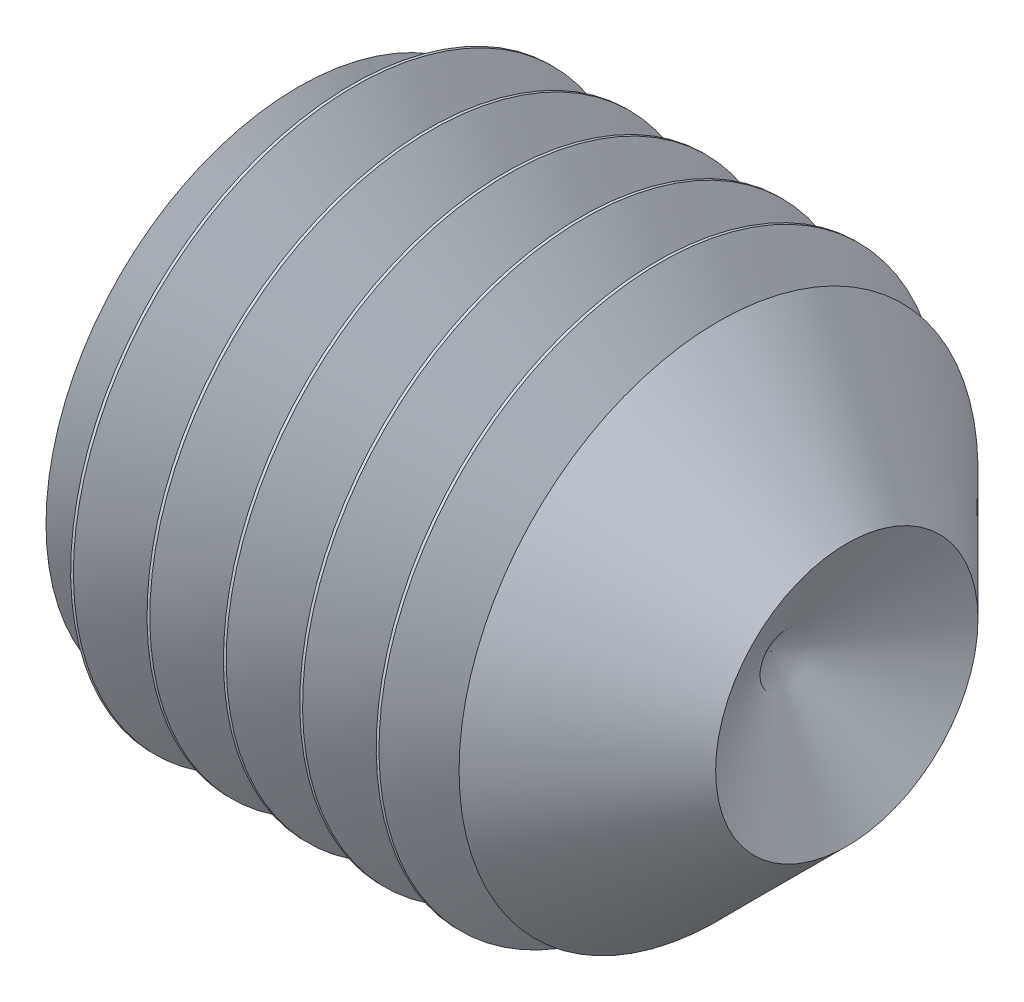
ISO-10303-21;
HEADER;
FILE_DESCRIPTION(('STEP AP214'),'2;1');
FILE_NAME('part.step','',(''),(''),'','','');
FILE_SCHEMA(('AUTOMOTIVE_DESIGN { 1 0 10303 214 1 1 1 1 }'));
ENDSEC;
DATA;
#1=APPLICATION_CONTEXT('core data for automotive mechanical design processes');
#2=APPLICATION_PROTOCOL_DEFINITION('international standard','automotive_design',2000,#1);
#3=PRODUCT_CONTEXT('',#1,'mechanical');
#4=PRODUCT('Part','Part','',(#3));
#5=PRODUCT_RELATED_PRODUCT_CATEGORY('part','',(#4));
#6=PRODUCT_DEFINITION_FORMATION('','',#4);
#7=PRODUCT_DEFINITION_CONTEXT('part definition',#1,'design');
#8=PRODUCT_DEFINITION('design','',#6,#7);
#9=PRODUCT_DEFINITION_SHAPE('','',#8);
#10=(LENGTH_UNIT() NAMED_UNIT(*) SI_UNIT(.MILLI.,.METRE.));
#11=(NAMED_UNIT(*) PLANE_ANGLE_UNIT() SI_UNIT($,.RADIAN.));
#12=(NAMED_UNIT(*) SI_UNIT($,.STERADIAN.) SOLID_ANGLE_UNIT());
#13=UNCERTAINTY_MEASURE_WITH_UNIT(LENGTH_MEASURE(1.E-05),#10,'distance_accuracy_value','');
#14=(GEOMETRIC_REPRESENTATION_CONTEXT(3) GLOBAL_UNCERTAINTY_ASSIGNED_CONTEXT((#13)) GLOBAL_UNIT_ASSIGNED_CONTEXT((#10,
#11,#12)) REPRESENTATION_CONTEXT('',''));
#15=CARTESIAN_POINT('',(0.,0.,0.));
#16=DIRECTION('',(0.,0.,1.));
#17=DIRECTION('',(1.,0.,0.));
#18=AXIS2_PLACEMENT_3D('',#15,#16,#17);
#19=CARTESIAN_POINT('',(0.,0.,0.));
#20=DIRECTION('',(-1.,0.,0.));
#21=DIRECTION('',(0.,0.,1.));
#22=AXIS2_PLACEMENT_3D('',#19,#20,#21);
#23=PLANE('',#22);
#24=CARTESIAN_POINT('',(0.,0.,0.));
#25=DIRECTION('',(-1.,0.,0.));
#26=DIRECTION('',(0.,0.,1.));
#27=AXIS2_PLACEMENT_3D('',#24,#25,#26);
#28=CIRCLE('',#27,1.2195);
#29=CARTESIAN_POINT('',(0.,0.,1.2195));
#30=VERTEX_POINT('',#29);
#31=EDGE_CURVE('E11',#30,#30,#28,.T.);
#32=ORIENTED_EDGE('',*,*,#31,.T.);
#33=EDGE_LOOP('',(#32));
#34=FACE_BOUND('',#33,.T.);
#35=DIRECTION('',(0.,0.,-1.));
#36=VECTOR('',#35,1.);
#37=CARTESIAN_POINT('',(0.,0.750000000000003,0.433012701892216));
#38=LINE('',#37,#36);
#39=CARTESIAN_POINT('',(0.,0.750000000000003,0.433012701892216));
#40=VERTEX_POINT('',#39);
#41=CARTESIAN_POINT('',(0.,0.750000000000003,-0.433012701892222));
#42=VERTEX_POINT('',#41);
#43=EDGE_CURVE('E97',#40,#42,#38,.T.);
#44=ORIENTED_EDGE('',*,*,#43,.F.);
#45=DIRECTION('',(0.,-0.866025403784439,0.5));
#46=VECTOR('',#45,1.);
#47=CARTESIAN_POINT('',(0.,0.750000000000003,0.433012701892216));
#48=LINE('',#47,#46);
#49=CARTESIAN_POINT('',(0.,0.,0.866025403784435));
#50=VERTEX_POINT('',#49);
#51=EDGE_CURVE('E50',#40,#50,#48,.T.);
#52=ORIENTED_EDGE('',*,*,#51,.T.);
#53=DIRECTION('',(0.,0.866025403784439,0.5));
#54=VECTOR('',#53,1.);
#55=CARTESIAN_POINT('',(0.,-0.749999999999996,0.433012701892216));
#56=LINE('',#55,#54);
#57=CARTESIAN_POINT('',(0.,-0.749999999999996,0.433012701892216));
#58=VERTEX_POINT('',#57);
#59=EDGE_CURVE('E103',#58,#50,#56,.T.);
#60=ORIENTED_EDGE('',*,*,#59,.F.);
#61=DIRECTION('',(0.,0.,-1.));
#62=VECTOR('',#61,1.);
#63=CARTESIAN_POINT('',(0.,-0.749999999999996,0.433012701892216));
#64=LINE('',#63,#62);
#65=CARTESIAN_POINT('',(0.,-0.749999999999996,-0.433012701892222));
#66=VERTEX_POINT('',#65);
#67=EDGE_CURVE('E124',#58,#66,#64,.T.);
#68=ORIENTED_EDGE('',*,*,#67,.T.);
#69=DIRECTION('',(0.,0.866025403784438,-0.500000000000001));
#70=VECTOR('',#69,1.);
#71=CARTESIAN_POINT('',(0.,-0.749999999999996,-0.433012701892222));
#72=LINE('',#71,#70);
#73=CARTESIAN_POINT('',(0.,0.,-0.866025403784441));
#74=VERTEX_POINT('',#73);
#75=EDGE_CURVE('E127',#66,#74,#72,.T.);
#76=ORIENTED_EDGE('',*,*,#75,.T.);
#77=DIRECTION('',(0.,-0.866025403784439,-0.5));
#78=VECTOR('',#77,1.);
#79=CARTESIAN_POINT('',(0.,0.750000000000003,-0.433012701892222));
#80=LINE('',#79,#78);
#81=EDGE_CURVE('E130',#42,#74,#80,.T.);
#82=ORIENTED_EDGE('',*,*,#81,.F.);
#83=EDGE_LOOP('',(#44,#52,#60,#68,#76,#82));
#84=FACE_BOUND('',#83,.T.);
#85=ADVANCED_FACE('F34',(#34,#84),#23,.T.);
#86=CARTESIAN_POINT('',(0.,0.,0.));
#87=DIRECTION('',(1.,0.,0.));
#88=DIRECTION('',(0.,0.,-1.));
#89=AXIS2_PLACEMENT_3D('',#86,#87,#88);
#90=CONICAL_SURFACE('',#89,1.2195,1.0471975511966);
#91=CARTESIAN_POINT('',(0.0731865121550403,0.,0.));
#92=DIRECTION('',(-1.,0.,0.));
#93=DIRECTION('',(0.,-1.,0.));
#94=AXIS2_PLACEMENT_3D('',#91,#92,#93);
#95=CIRCLE('',#94,1.34626275748129);
#96=CARTESIAN_POINT('',(0.0731865121550405,-1.34626275748129,0.));
#97=VERTEX_POINT('',#96);
#98=EDGE_CURVE('E122',#97,#97,#95,.F.);
#99=ORIENTED_EDGE('',*,*,#98,.F.);
#100=EDGE_LOOP('',(#99));
#101=FACE_BOUND('',#100,.T.);
#102=ORIENTED_EDGE('',*,*,#31,.F.);
#103=EDGE_LOOP('',(#102));
#104=FACE_BOUND('',#103,.T.);
#105=ADVANCED_FACE('F220',(#101,#104),#90,.T.);
#106=CARTESIAN_POINT('',(2.,0.750000000000003,0.433012701892216));
#107=DIRECTION('',(0.,-0.5,-0.866025403784438));
#108=DIRECTION('',(0.,0.866025403784439,-0.5));
#109=AXIS2_PLACEMENT_3D('',#106,#107,#108);
#110=PLANE('',#109);
#111=ORIENTED_EDGE('',*,*,#51,.F.);
#112=DIRECTION('',(-1.,0.,0.));
#113=VECTOR('',#112,1.);
#114=CARTESIAN_POINT('',(2.,0.750000000000003,0.433012701892216));
#115=LINE('',#114,#113);
#116=CARTESIAN_POINT('',(2.,0.750000000000003,0.433012701892216));
#117=VERTEX_POINT('',#116);
#118=EDGE_CURVE('E91',#117,#40,#115,.T.);
#119=ORIENTED_EDGE('',*,*,#118,.F.);
#120=DIRECTION('',(0.,-0.866025403784439,0.5));
#121=VECTOR('',#120,1.);
#122=CARTESIAN_POINT('',(2.,0.750000000000003,0.433012701892216));
#123=LINE('',#122,#121);
#124=CARTESIAN_POINT('',(2.,0.,0.866025403784435));
#125=VERTEX_POINT('',#124);
#126=EDGE_CURVE('E86',#117,#125,#123,.T.);
#127=ORIENTED_EDGE('',*,*,#126,.T.);
#128=DIRECTION('',(-1.,0.,0.));
#129=VECTOR('',#128,1.);
#130=CARTESIAN_POINT('',(2.,0.,0.866025403784435));
#131=LINE('',#130,#129);
#132=EDGE_CURVE('E89',#125,#50,#131,.T.);
#133=ORIENTED_EDGE('',*,*,#132,.T.);
#134=EDGE_LOOP('',(#111,#119,#127,#133));
#135=FACE_BOUND('',#134,.T.);
#136=ADVANCED_FACE('F88',(#135),#110,.T.);
#137=CARTESIAN_POINT('',(2.,-0.749999999999996,0.433012701892216));
#138=DIRECTION('',(0.,-0.5,0.866025403784439));
#139=DIRECTION('',(0.,-0.866025403784439,-0.5));
#140=AXIS2_PLACEMENT_3D('',#137,#138,#139);
#141=PLANE('',#140);
#142=ORIENTED_EDGE('',*,*,#59,.T.);
#143=ORIENTED_EDGE('',*,*,#132,.F.);
#144=DIRECTION('',(0.,0.866025403784439,0.5));
#145=VECTOR('',#144,1.);
#146=CARTESIAN_POINT('',(2.,-0.749999999999996,0.433012701892216));
#147=LINE('',#146,#145);
#148=CARTESIAN_POINT('',(2.,-0.749999999999996,0.433012701892216));
#149=VERTEX_POINT('',#148);
#150=EDGE_CURVE('E96',#149,#125,#147,.T.);
#151=ORIENTED_EDGE('',*,*,#150,.F.);
#152=DIRECTION('',(-1.,0.,0.));
#153=VECTOR('',#152,1.);
#154=CARTESIAN_POINT('',(2.,-0.749999999999996,0.433012701892216));
#155=LINE('',#154,#153);
#156=EDGE_CURVE('E104',#149,#58,#155,.T.);
#157=ORIENTED_EDGE('',*,*,#156,.T.);
#158=EDGE_LOOP('',(#142,#143,#151,#157));
#159=FACE_BOUND('',#158,.T.);
#160=ADVANCED_FACE('F101',(#159),#141,.F.);
#161=CARTESIAN_POINT('',(2.,-0.749999999999996,0.433012701892216));
#162=DIRECTION('',(0.,1.,0.));
#163=DIRECTION('',(0.,0.,1.));
#164=AXIS2_PLACEMENT_3D('',#161,#162,#163);
#165=PLANE('',#164);
#166=ORIENTED_EDGE('',*,*,#67,.F.);
#167=ORIENTED_EDGE('',*,*,#156,.F.);
#168=DIRECTION('',(0.,0.,-1.));
#169=VECTOR('',#168,1.);
#170=CARTESIAN_POINT('',(2.,-0.749999999999996,0.433012701892216));
#171=LINE('',#170,#169);
#172=CARTESIAN_POINT('',(2.,-0.749999999999996,-0.433012701892222));
#173=VERTEX_POINT('',#172);
#174=EDGE_CURVE('E109',#149,#173,#171,.T.);
#175=ORIENTED_EDGE('',*,*,#174,.T.);
#176=DIRECTION('',(-1.,0.,0.));
#177=VECTOR('',#176,1.);
#178=CARTESIAN_POINT('',(2.,-0.749999999999996,-0.433012701892222));
#179=LINE('',#178,#177);
#180=EDGE_CURVE('E140',#173,#66,#179,.T.);
#181=ORIENTED_EDGE('',*,*,#180,.T.);
#182=EDGE_LOOP('',(#166,#167,#175,#181));
#183=FACE_BOUND('',#182,.T.);
#184=ADVANCED_FACE('F242',(#183),#165,.T.);
#185=CARTESIAN_POINT('',(2.,-0.749999999999996,-0.433012701892222));
#186=DIRECTION('',(0.,0.500000000000001,0.866025403784438));
#187=DIRECTION('',(0.,-0.866025403784438,0.500000000000001));
#188=AXIS2_PLACEMENT_3D('',#185,#186,#187);
#189=PLANE('',#188);
#190=ORIENTED_EDGE('',*,*,#75,.F.);
#191=ORIENTED_EDGE('',*,*,#180,.F.);
#192=DIRECTION('',(0.,0.866025403784438,-0.500000000000001));
#193=VECTOR('',#192,1.);
#194=CARTESIAN_POINT('',(2.,-0.749999999999996,-0.433012701892222));
#195=LINE('',#194,#193);
#196=CARTESIAN_POINT('',(2.,0.,-0.866025403784441));
#197=VERTEX_POINT('',#196);
#198=EDGE_CURVE('E111',#173,#197,#195,.T.);
#199=ORIENTED_EDGE('',*,*,#198,.T.);
#200=DIRECTION('',(-1.,0.,0.));
#201=VECTOR('',#200,1.);
#202=CARTESIAN_POINT('',(2.,0.,-0.866025403784441));
#203=LINE('',#202,#201);
#204=EDGE_CURVE('E138',#197,#74,#203,.T.);
#205=ORIENTED_EDGE('',*,*,#204,.T.);
#206=EDGE_LOOP('',(#190,#191,#199,#205));
#207=FACE_BOUND('',#206,.T.);
#208=ADVANCED_FACE('F238',(#207),#189,.T.);
#209=CARTESIAN_POINT('',(2.,0.750000000000003,-0.433012701892222));
#210=DIRECTION('',(0.,0.5,-0.866025403784439));
#211=DIRECTION('',(0.,0.866025403784439,0.5));
#212=AXIS2_PLACEMENT_3D('',#209,#210,#211);
#213=PLANE('',#212);
#214=ORIENTED_EDGE('',*,*,#81,.T.);
#215=ORIENTED_EDGE('',*,*,#204,.F.);
#216=DIRECTION('',(0.,-0.866025403784439,-0.5));
#217=VECTOR('',#216,1.);
#218=CARTESIAN_POINT('',(2.,0.750000000000003,-0.433012701892222));
#219=LINE('',#218,#217);
#220=CARTESIAN_POINT('',(2.,0.750000000000003,-0.433012701892222));
#221=VERTEX_POINT('',#220);
#222=EDGE_CURVE('E116',#221,#197,#219,.T.);
#223=ORIENTED_EDGE('',*,*,#222,.F.);
#224=DIRECTION('',(-1.,0.,0.));
#225=VECTOR('',#224,1.);
#226=CARTESIAN_POINT('',(2.,0.750000000000003,-0.433012701892222));
#227=LINE('',#226,#225);
#228=EDGE_CURVE('E136',#221,#42,#227,.T.);
#229=ORIENTED_EDGE('',*,*,#228,.T.);
#230=EDGE_LOOP('',(#214,#215,#223,#229));
#231=FACE_BOUND('',#230,.T.);
#232=ADVANCED_FACE('F235',(#231),#213,.F.);
#233=CARTESIAN_POINT('',(2.,0.750000000000003,0.433012701892216));
#234=DIRECTION('',(0.,1.,0.));
#235=DIRECTION('',(0.,0.,1.));
#236=AXIS2_PLACEMENT_3D('',#233,#234,#235);
#237=PLANE('',#236);
#238=ORIENTED_EDGE('',*,*,#43,.T.);
#239=ORIENTED_EDGE('',*,*,#228,.F.);
#240=DIRECTION('',(0.,0.,-1.));
#241=VECTOR('',#240,1.);
#242=CARTESIAN_POINT('',(2.,0.750000000000003,0.433012701892216));
#243=LINE('',#242,#241);
#244=EDGE_CURVE('E119',#117,#221,#243,.T.);
#245=ORIENTED_EDGE('',*,*,#244,.F.);
#246=ORIENTED_EDGE('',*,*,#118,.T.);
#247=EDGE_LOOP('',(#238,#239,#245,#246));
#248=FACE_BOUND('',#247,.T.);
#249=ADVANCED_FACE('F231',(#248),#237,.F.);
#250=CARTESIAN_POINT('',(2.,1.5,0.));
#251=DIRECTION('',(1.,0.,0.));
#252=DIRECTION('',(0.,0.,-1.));
#253=AXIS2_PLACEMENT_3D('',#250,#251,#252);
#254=PLANE('',#253);
#255=ORIENTED_EDGE('',*,*,#126,.F.);
#256=ORIENTED_EDGE('',*,*,#244,.T.);
#257=ORIENTED_EDGE('',*,*,#222,.T.);
#258=ORIENTED_EDGE('',*,*,#198,.F.);
#259=ORIENTED_EDGE('',*,*,#174,.F.);
#260=ORIENTED_EDGE('',*,*,#150,.T.);
#261=EDGE_LOOP('',(#255,#256,#257,#258,#259,#260));
#262=FACE_BOUND('',#261,.T.);
#263=ADVANCED_FACE('F107',(#262),#254,.F.);
#264=CARTESIAN_POINT('',(0.358354964975511,0.,0.));
#265=DIRECTION('',(1.,0.,0.));
#266=DIRECTION('',(0.,1.,0.));
#267=AXIS2_PLACEMENT_3D('',#264,#265,#266);
#268=CONICAL_SURFACE('',#267,1.5,0.959931088596883);
#269=CARTESIAN_POINT('',(0.161946750507689,0.,0.));
#270=DIRECTION('',(-1.,0.,0.));
#271=DIRECTION('',(0.,-1.,0.));
#272=AXIS2_PLACEMENT_3D('',#269,#270,#271);
#273=CIRCLE('',#272,1.2195);
#274=CARTESIAN_POINT('',(0.161946750507689,-1.2195,0.));
#275=VERTEX_POINT('',#274);
#276=EDGE_CURVE('E149',#275,#275,#273,.T.);
#277=ORIENTED_EDGE('',*,*,#276,.F.);
#278=EDGE_LOOP('',(#277));
#279=FACE_BOUND('',#278,.T.);
#280=CARTESIAN_POINT('',(0.358354964975511,0.,0.));
#281=DIRECTION('',(-1.,0.,0.));
#282=DIRECTION('',(0.,-1.,0.));
#283=AXIS2_PLACEMENT_3D('',#280,#281,#282);
#284=CIRCLE('',#283,1.5);
#285=CARTESIAN_POINT('',(0.358354964975512,-1.5,0.));
#286=VERTEX_POINT('',#285);
#287=EDGE_CURVE('E145',#286,#286,#284,.T.);
#288=ORIENTED_EDGE('',*,*,#287,.T.);
#289=EDGE_LOOP('',(#288));
#290=FACE_BOUND('',#289,.T.);
#291=ADVANCED_FACE('F273',(#279,#290),#268,.T.);
#292=CARTESIAN_POINT('',(0.161946750507689,0.,0.));
#293=DIRECTION('',(-1.,0.,0.));
#294=DIRECTION('',(0.,-1.,0.));
#295=AXIS2_PLACEMENT_3D('',#292,#293,#294);
#296=CONICAL_SURFACE('',#295,1.2195,0.959931088596876);
#297=ORIENTED_EDGE('',*,*,#98,.T.);
#298=EDGE_LOOP('',(#297));
#299=FACE_BOUND('',#298,.T.);
#300=ORIENTED_EDGE('',*,*,#276,.T.);
#301=EDGE_LOOP('',(#300));
#302=FACE_BOUND('',#301,.T.);
#303=ADVANCED_FACE('F263',(#299,#302),#296,.T.);
#304=CARTESIAN_POINT('',(-12.7,0.,0.));
#305=DIRECTION('',(-1.,0.,0.));
#306=DIRECTION('',(0.,0.,1.));
#307=AXIS2_PLACEMENT_3D('',#304,#305,#306);
#308=CYLINDRICAL_SURFACE('',#307,1.5);
#309=CARTESIAN_POINT('',(0.373149210915998,0.,0.));
#310=DIRECTION('',(-1.,0.,0.));
#311=DIRECTION('',(0.,-1.,0.));
#312=AXIS2_PLACEMENT_3D('',#309,#310,#311);
#313=CIRCLE('',#312,1.5);
#314=CARTESIAN_POINT('',(0.373149210915998,-1.5,0.));
#315=VERTEX_POINT('',#314);
#316=EDGE_CURVE('E158',#315,#315,#313,.T.);
#317=ORIENTED_EDGE('',*,*,#316,.T.);
#318=EDGE_LOOP('',(#317));
#319=FACE_BOUND('',#318,.T.);
#320=ORIENTED_EDGE('',*,*,#287,.F.);
#321=EDGE_LOOP('',(#320));
#322=FACE_BOUND('',#321,.T.);
#323=ADVANCED_FACE('F216',(#319,#322),#308,.T.);
#324=CARTESIAN_POINT('',(0.765965639851647,0.,0.));
#325=DIRECTION('',(1.,0.,0.));
#326=DIRECTION('',(0.,1.,0.));
#327=AXIS2_PLACEMENT_3D('',#324,#325,#326);
#328=CONICAL_SURFACE('',#327,1.5,0.959931088596883);
#329=CARTESIAN_POINT('',(0.569557425383824,0.,0.));
#330=DIRECTION('',(-1.,0.,0.));
#331=DIRECTION('',(0.,-1.,0.));
#332=AXIS2_PLACEMENT_3D('',#329,#330,#331);
#333=CIRCLE('',#332,1.2195);
#334=CARTESIAN_POINT('',(0.569557425383824,-1.2195,0.));
#335=VERTEX_POINT('',#334);
#336=EDGE_CURVE('E161',#335,#335,#333,.T.);
#337=ORIENTED_EDGE('',*,*,#336,.F.);
#338=EDGE_LOOP('',(#337));
#339=FACE_BOUND('',#338,.T.);
#340=CARTESIAN_POINT('',(0.765965639851647,0.,0.));
#341=DIRECTION('',(-1.,0.,0.));
#342=DIRECTION('',(0.,-1.,0.));
#343=AXIS2_PLACEMENT_3D('',#340,#341,#342);
#344=CIRCLE('',#343,1.5);
#345=CARTESIAN_POINT('',(0.765965639851647,-1.5,0.));
#346=VERTEX_POINT('',#345);
#347=EDGE_CURVE('E153',#346,#346,#344,.T.);
#348=ORIENTED_EDGE('',*,*,#347,.T.);
#349=EDGE_LOOP('',(#348));
#350=FACE_BOUND('',#349,.T.);
#351=ADVANCED_FACE('F262',(#339,#350),#328,.T.);
#352=CARTESIAN_POINT('',(0.569557425383824,0.,0.));
#353=DIRECTION('',(-1.,0.,0.));
#354=DIRECTION('',(0.,-1.,0.));
#355=AXIS2_PLACEMENT_3D('',#352,#353,#354);
#356=CONICAL_SURFACE('',#355,1.2195,0.959931088596876);
#357=ORIENTED_EDGE('',*,*,#316,.F.);
#358=EDGE_LOOP('',(#357));
#359=FACE_BOUND('',#358,.T.);
#360=ORIENTED_EDGE('',*,*,#336,.T.);
#361=EDGE_LOOP('',(#360));
#362=FACE_BOUND('',#361,.T.);
#363=ADVANCED_FACE('F270',(#359,#362),#356,.T.);
#364=CARTESIAN_POINT('',(0.780759885792133,0.,0.));
#365=DIRECTION('',(-1.,0.,0.));
#366=DIRECTION('',(0.,-1.,0.));
#367=AXIS2_PLACEMENT_3D('',#364,#365,#366);
#368=CIRCLE('',#367,1.5);
#369=CARTESIAN_POINT('',(0.780759885792134,-1.5,0.));
#370=VERTEX_POINT('',#369);
#371=EDGE_CURVE('E167',#370,#370,#368,.T.);
#372=ORIENTED_EDGE('',*,*,#371,.T.);
#373=EDGE_LOOP('',(#372));
#374=FACE_BOUND('',#373,.T.);
#375=ORIENTED_EDGE('',*,*,#347,.F.);
#376=EDGE_LOOP('',(#375));
#377=FACE_BOUND('',#376,.T.);
#378=ADVANCED_FACE('F265',(#374,#377),#308,.T.);
#379=CARTESIAN_POINT('',(1.17357631472778,0.,0.));
#380=DIRECTION('',(1.,0.,0.));
#381=DIRECTION('',(0.,1.,0.));
#382=AXIS2_PLACEMENT_3D('',#379,#380,#381);
#383=CONICAL_SURFACE('',#382,1.5,0.959931088596883);
#384=CARTESIAN_POINT('',(0.977168100259959,0.,0.));
#385=DIRECTION('',(-1.,0.,0.));
#386=DIRECTION('',(0.,-1.,0.));
#387=AXIS2_PLACEMENT_3D('',#384,#385,#386);
#388=CIRCLE('',#387,1.2195);
#389=CARTESIAN_POINT('',(0.977168100259959,-1.2195,0.));
#390=VERTEX_POINT('',#389);
#391=EDGE_CURVE('E170',#390,#390,#388,.T.);
#392=ORIENTED_EDGE('',*,*,#391,.F.);
#393=EDGE_LOOP('',(#392));
#394=FACE_BOUND('',#393,.T.);
#395=CARTESIAN_POINT('',(1.17357631472778,0.,0.));
#396=DIRECTION('',(-1.,0.,0.));
#397=DIRECTION('',(0.,-1.,0.));
#398=AXIS2_PLACEMENT_3D('',#395,#396,#397);
#399=CIRCLE('',#398,1.5);
#400=CARTESIAN_POINT('',(1.17357631472778,-1.5,0.));
#401=VERTEX_POINT('',#400);
#402=EDGE_CURVE('E164',#401,#401,#399,.T.);
#403=ORIENTED_EDGE('',*,*,#402,.T.);
#404=EDGE_LOOP('',(#403));
#405=FACE_BOUND('',#404,.T.);
#406=ADVANCED_FACE('F277',(#394,#405),#383,.T.);
#407=CARTESIAN_POINT('',(0.977168100259959,0.,0.));
#408=DIRECTION('',(-1.,0.,0.));
#409=DIRECTION('',(0.,-1.,0.));
#410=AXIS2_PLACEMENT_3D('',#407,#408,#409);
#411=CONICAL_SURFACE('',#410,1.2195,0.959931088596876);
#412=ORIENTED_EDGE('',*,*,#371,.F.);
#413=EDGE_LOOP('',(#412));
#414=FACE_BOUND('',#413,.T.);
#415=ORIENTED_EDGE('',*,*,#391,.T.);
#416=EDGE_LOOP('',(#415));
#417=FACE_BOUND('',#416,.T.);
#418=ADVANCED_FACE('F284',(#414,#417),#411,.T.);
#419=CARTESIAN_POINT('',(1.18837056066827,0.,0.));
#420=DIRECTION('',(-1.,0.,0.));
#421=DIRECTION('',(0.,-1.,0.));
#422=AXIS2_PLACEMENT_3D('',#419,#420,#421);
#423=CIRCLE('',#422,1.5);
#424=CARTESIAN_POINT('',(1.18837056066827,-1.5,0.));
#425=VERTEX_POINT('',#424);
#426=EDGE_CURVE('E176',#425,#425,#423,.T.);
#427=ORIENTED_EDGE('',*,*,#426,.T.);
#428=EDGE_LOOP('',(#427));
#429=FACE_BOUND('',#428,.T.);
#430=ORIENTED_EDGE('',*,*,#402,.F.);
#431=EDGE_LOOP('',(#430));
#432=FACE_BOUND('',#431,.T.);
#433=ADVANCED_FACE('F279',(#429,#432),#308,.T.);
#434=CARTESIAN_POINT('',(1.58118698960392,0.,0.));
#435=DIRECTION('',(1.,0.,0.));
#436=DIRECTION('',(0.,1.,0.));
#437=AXIS2_PLACEMENT_3D('',#434,#435,#436);
#438=CONICAL_SURFACE('',#437,1.5,0.959931088596883);
#439=CARTESIAN_POINT('',(1.38477877513609,0.,0.));
#440=DIRECTION('',(-1.,0.,0.));
#441=DIRECTION('',(0.,-1.,0.));
#442=AXIS2_PLACEMENT_3D('',#439,#440,#441);
#443=CIRCLE('',#442,1.2195);
#444=CARTESIAN_POINT('',(1.38477877513609,-1.2195,0.));
#445=VERTEX_POINT('',#444);
#446=EDGE_CURVE('E179',#445,#445,#443,.T.);
#447=ORIENTED_EDGE('',*,*,#446,.F.);
#448=EDGE_LOOP('',(#447));
#449=FACE_BOUND('',#448,.T.);
#450=CARTESIAN_POINT('',(1.58118698960392,0.,0.));
#451=DIRECTION('',(-1.,0.,0.));
#452=DIRECTION('',(0.,-1.,0.));
#453=AXIS2_PLACEMENT_3D('',#450,#451,#452);
#454=CIRCLE('',#453,1.5);
#455=CARTESIAN_POINT('',(1.58118698960392,-1.5,0.));
#456=VERTEX_POINT('',#455);
#457=EDGE_CURVE('E173',#456,#456,#454,.T.);
#458=ORIENTED_EDGE('',*,*,#457,.T.);
#459=EDGE_LOOP('',(#458));
#460=FACE_BOUND('',#459,.T.);
#461=ADVANCED_FACE('F291',(#449,#460),#438,.T.);
#462=CARTESIAN_POINT('',(1.38477877513609,0.,0.));
#463=DIRECTION('',(-1.,0.,0.));
#464=DIRECTION('',(0.,-1.,0.));
#465=AXIS2_PLACEMENT_3D('',#462,#463,#464);
#466=CONICAL_SURFACE('',#465,1.2195,0.959931088596876);
#467=ORIENTED_EDGE('',*,*,#426,.F.);
#468=EDGE_LOOP('',(#467));
#469=FACE_BOUND('',#468,.T.);
#470=ORIENTED_EDGE('',*,*,#446,.T.);
#471=EDGE_LOOP('',(#470));
#472=FACE_BOUND('',#471,.T.);
#473=ADVANCED_FACE('F297',(#469,#472),#466,.T.);
#474=CARTESIAN_POINT('',(1.5959812355444,0.,0.));
#475=DIRECTION('',(-1.,0.,0.));
#476=DIRECTION('',(0.,-1.,0.));
#477=AXIS2_PLACEMENT_3D('',#474,#475,#476);
#478=CIRCLE('',#477,1.5);
#479=CARTESIAN_POINT('',(1.5959812355444,-1.5,0.));
#480=VERTEX_POINT('',#479);
#481=EDGE_CURVE('E185',#480,#480,#478,.T.);
#482=ORIENTED_EDGE('',*,*,#481,.T.);
#483=EDGE_LOOP('',(#482));
#484=FACE_BOUND('',#483,.T.);
#485=ORIENTED_EDGE('',*,*,#457,.F.);
#486=EDGE_LOOP('',(#485));
#487=FACE_BOUND('',#486,.T.);
#488=ADVANCED_FACE('F215',(#484,#487),#308,.T.);
#489=CARTESIAN_POINT('',(1.98879766448005,0.,0.));
#490=DIRECTION('',(1.,0.,0.));
#491=DIRECTION('',(0.,1.,0.));
#492=AXIS2_PLACEMENT_3D('',#489,#490,#491);
#493=CONICAL_SURFACE('',#492,1.5,0.959931088596883);
#494=CARTESIAN_POINT('',(1.79238945001223,0.,0.));
#495=DIRECTION('',(-1.,0.,0.));
#496=DIRECTION('',(0.,-1.,0.));
#497=AXIS2_PLACEMENT_3D('',#494,#495,#496);
#498=CIRCLE('',#497,1.2195);
#499=CARTESIAN_POINT('',(1.79238945001223,-1.2195,0.));
#500=VERTEX_POINT('',#499);
#501=EDGE_CURVE('E188',#500,#500,#498,.T.);
#502=ORIENTED_EDGE('',*,*,#501,.F.);
#503=EDGE_LOOP('',(#502));
#504=FACE_BOUND('',#503,.T.);
#505=CARTESIAN_POINT('',(1.98879766448005,0.,0.));
#506=DIRECTION('',(-1.,0.,0.));
#507=DIRECTION('',(0.,-1.,0.));
#508=AXIS2_PLACEMENT_3D('',#505,#506,#507);
#509=CIRCLE('',#508,1.5);
#510=CARTESIAN_POINT('',(1.98879766448005,-1.5,0.));
#511=VERTEX_POINT('',#510);
#512=EDGE_CURVE('E182',#511,#511,#509,.T.);
#513=ORIENTED_EDGE('',*,*,#512,.T.);
#514=EDGE_LOOP('',(#513));
#515=FACE_BOUND('',#514,.T.);
#516=ADVANCED_FACE('F304',(#504,#515),#493,.T.);
#517=CARTESIAN_POINT('',(1.79238945001223,0.,0.));
#518=DIRECTION('',(-1.,0.,0.));
#519=DIRECTION('',(0.,-1.,0.));
#520=AXIS2_PLACEMENT_3D('',#517,#518,#519);
#521=CONICAL_SURFACE('',#520,1.2195,0.959931088596876);
#522=ORIENTED_EDGE('',*,*,#481,.F.);
#523=EDGE_LOOP('',(#522));
#524=FACE_BOUND('',#523,.T.);
#525=ORIENTED_EDGE('',*,*,#501,.T.);
#526=EDGE_LOOP('',(#525));
#527=FACE_BOUND('',#526,.T.);
#528=ADVANCED_FACE('F212',(#524,#527),#521,.T.);
#529=CARTESIAN_POINT('',(2.00359191042054,0.,0.));
#530=DIRECTION('',(-1.,0.,0.));
#531=DIRECTION('',(0.,-1.,0.));
#532=AXIS2_PLACEMENT_3D('',#529,#530,#531);
#533=CIRCLE('',#532,1.5);
#534=CARTESIAN_POINT('',(2.00359191042054,-1.5,0.));
#535=VERTEX_POINT('',#534);
#536=EDGE_CURVE('E191',#535,#535,#533,.T.);
#537=ORIENTED_EDGE('',*,*,#536,.T.);
#538=EDGE_LOOP('',(#537));
#539=FACE_BOUND('',#538,.T.);
#540=ORIENTED_EDGE('',*,*,#512,.F.);
#541=EDGE_LOOP('',(#540));
#542=FACE_BOUND('',#541,.T.);
#543=ADVANCED_FACE('F202',(#539,#542),#308,.T.);
#544=CARTESIAN_POINT('',(2.39640833935619,0.,0.));
#545=DIRECTION('',(1.,0.,0.));
#546=DIRECTION('',(0.,1.,0.));
#547=AXIS2_PLACEMENT_3D('',#544,#545,#546);
#548=CONICAL_SURFACE('',#547,1.5,0.959931088596883);
#549=CARTESIAN_POINT('',(2.31552021441041,0.,0.));
#550=DIRECTION('',(1.,0.,0.));
#551=DIRECTION('',(0.,1.,0.));
#552=AXIS2_PLACEMENT_3D('',#549,#550,#551);
#553=CIRCLE('',#552,1.38447978558959);
#554=CARTESIAN_POINT('',(2.31552021441041,1.38447978558959,0.));
#555=VERTEX_POINT('',#554);
#556=EDGE_CURVE('E37',#555,#555,#553,.F.);
#557=ORIENTED_EDGE('',*,*,#556,.T.);
#558=EDGE_LOOP('',(#557));
#559=FACE_BOUND('',#558,.T.);
#560=CARTESIAN_POINT('',(2.20000012488837,0.,0.));
#561=DIRECTION('',(-1.,0.,0.));
#562=DIRECTION('',(0.,-1.,0.));
#563=AXIS2_PLACEMENT_3D('',#560,#561,#562);
#564=CIRCLE('',#563,1.2195);
#565=CARTESIAN_POINT('',(2.20000012488837,-1.2195,0.));
#566=VERTEX_POINT('',#565);
#567=EDGE_CURVE('E194',#566,#566,#564,.T.);
#568=ORIENTED_EDGE('',*,*,#567,.F.);
#569=EDGE_LOOP('',(#568));
#570=FACE_BOUND('',#569,.T.);
#571=ADVANCED_FACE('F200',(#559,#570),#548,.T.);
#572=CARTESIAN_POINT('',(2.20000012488837,0.,0.));
#573=DIRECTION('',(-1.,0.,0.));
#574=DIRECTION('',(0.,-1.,0.));
#575=AXIS2_PLACEMENT_3D('',#572,#573,#574);
#576=CONICAL_SURFACE('',#575,1.2195,0.959931088596876);
#577=ORIENTED_EDGE('',*,*,#536,.F.);
#578=EDGE_LOOP('',(#577));
#579=FACE_BOUND('',#578,.T.);
#580=ORIENTED_EDGE('',*,*,#567,.T.);
#581=EDGE_LOOP('',(#580));
#582=FACE_BOUND('',#581,.T.);
#583=ADVANCED_FACE('F198',(#579,#582),#576,.T.);
#584=CARTESIAN_POINT('',(2.59585481156726,0.,0.));
#585=DIRECTION('',(1.,0.,0.));
#586=DIRECTION('',(0.,0.,-1.));
#587=AXIS2_PLACEMENT_3D('',#584,#585,#586);
#588=CONICAL_SURFACE('',#587,0.,1.0471975511966);
#589=CARTESIAN_POINT('',(3.,0.,0.));
#590=DIRECTION('',(-1.,0.,0.));
#591=DIRECTION('',(0.,0.,1.));
#592=AXIS2_PLACEMENT_3D('',#589,#590,#591);
#593=CIRCLE('',#592,0.7);
#594=CARTESIAN_POINT('',(3.,0.,0.7));
#595=VERTEX_POINT('',#594);
#596=EDGE_CURVE('E42',#595,#595,#593,.T.);
#597=ORIENTED_EDGE('',*,*,#596,.F.);
#598=EDGE_LOOP('',(#597));
#599=FACE_BOUND('',#598,.T.);
#600=CARTESIAN_POINT('',(2.59585481156726,0.,0.));
#601=VERTEX_POINT('',#600);
#602=VERTEX_LOOP('',#601);
#603=FACE_BOUND('',#602,.T.);
#604=ADVANCED_FACE('F209',(#599,#603),#588,.F.);
#605=CARTESIAN_POINT('',(2.2,0.,0.));
#606=DIRECTION('',(-1.,0.,0.));
#607=DIRECTION('',(0.,0.,1.));
#608=AXIS2_PLACEMENT_3D('',#605,#606,#607);
#609=CONICAL_SURFACE('',#608,1.5,0.785398163397448);
#610=ORIENTED_EDGE('',*,*,#556,.F.);
#611=EDGE_LOOP('',(#610));
#612=FACE_BOUND('',#611,.T.);
#613=ORIENTED_EDGE('',*,*,#596,.T.);
#614=EDGE_LOOP('',(#613));
#615=FACE_BOUND('',#614,.T.);
#616=ADVANCED_FACE('F257',(#612,#615),#609,.T.);
#617=CLOSED_SHELL('',(#85,#105,#136,#160,#184,#208,#232,#249,#263,#291,#303,#323,#351,#363,#378,
#406,#418,#433,#461,#473,#488,#516,#528,#543,#571,#583,#604,#616));
#618=MANIFOLD_SOLID_BREP('B2',#617);
#619=ADVANCED_BREP_SHAPE_REPRESENTATION('',(#18,#618),#14);
#620=SHAPE_DEFINITION_REPRESENTATION(#9,#619);
ENDSEC;
END-ISO-10303-21;
